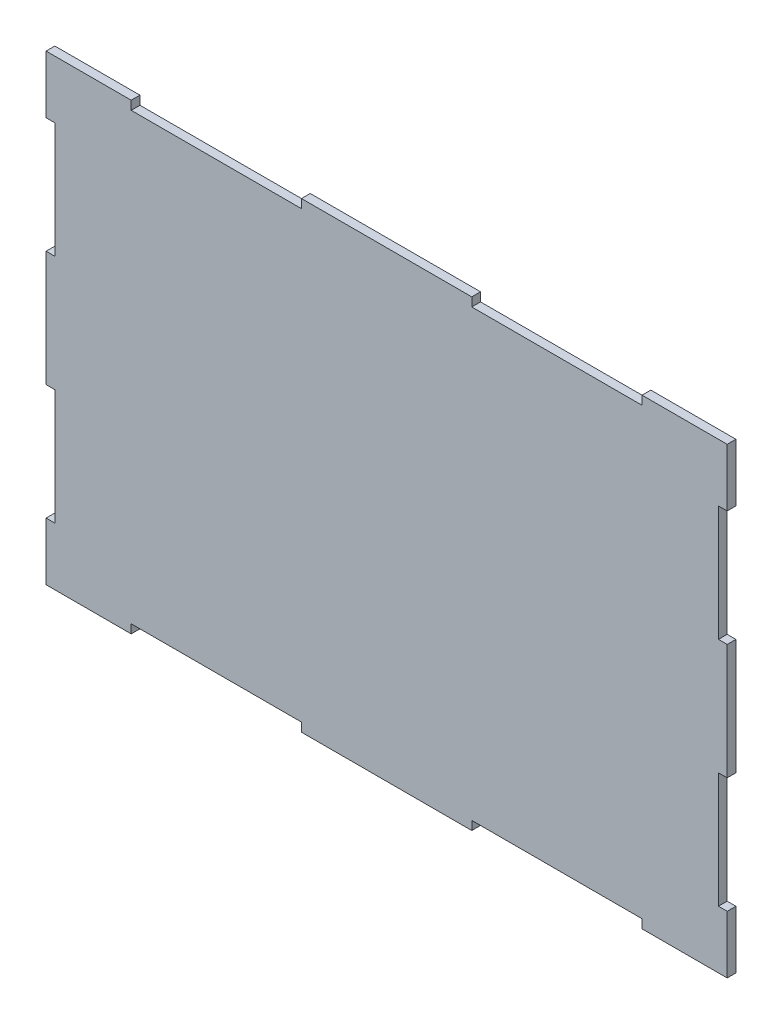
ISO-10303-21;
HEADER;
FILE_DESCRIPTION(('STEP AP214'),'2;1');
FILE_NAME('part.step','',(''),(''),'','','');
FILE_SCHEMA(('AUTOMOTIVE_DESIGN { 1 0 10303 214 1 1 1 1 }'));
ENDSEC;
DATA;
#1=APPLICATION_CONTEXT('core data for automotive mechanical design processes');
#2=APPLICATION_PROTOCOL_DEFINITION('international standard','automotive_design',2000,#1);
#3=PRODUCT_CONTEXT('',#1,'mechanical');
#4=PRODUCT('Part','Part','',(#3));
#5=PRODUCT_RELATED_PRODUCT_CATEGORY('part','',(#4));
#6=PRODUCT_DEFINITION_FORMATION('','',#4);
#7=PRODUCT_DEFINITION_CONTEXT('part definition',#1,'design');
#8=PRODUCT_DEFINITION('design','',#6,#7);
#9=PRODUCT_DEFINITION_SHAPE('','',#8);
#10=(LENGTH_UNIT() NAMED_UNIT(*) SI_UNIT(.MILLI.,.METRE.));
#11=(NAMED_UNIT(*) PLANE_ANGLE_UNIT() SI_UNIT($,.RADIAN.));
#12=(NAMED_UNIT(*) SI_UNIT($,.STERADIAN.) SOLID_ANGLE_UNIT());
#13=UNCERTAINTY_MEASURE_WITH_UNIT(LENGTH_MEASURE(1.E-05),#10,'distance_accuracy_value','');
#14=(GEOMETRIC_REPRESENTATION_CONTEXT(3) GLOBAL_UNCERTAINTY_ASSIGNED_CONTEXT((#13)) GLOBAL_UNIT_ASSIGNED_CONTEXT((#10,
#11,#12)) REPRESENTATION_CONTEXT('',''));
#15=CARTESIAN_POINT('',(0.,0.,0.));
#16=DIRECTION('',(0.,0.,1.));
#17=DIRECTION('',(1.,0.,0.));
#18=AXIS2_PLACEMENT_3D('',#15,#16,#17);
#19=CARTESIAN_POINT('',(140.,-95.,3.6));
#20=DIRECTION('',(-1.,0.,0.));
#21=DIRECTION('',(0.,-1.,0.));
#22=AXIS2_PLACEMENT_3D('',#19,#20,#21);
#23=PLANE('',#22);
#24=DIRECTION('',(0.,1.,0.));
#25=VECTOR('',#24,1.);
#26=CARTESIAN_POINT('',(140.,-95.,0.));
#27=LINE('',#26,#25);
#28=CARTESIAN_POINT('',(140.,-95.,0.));
#29=VERTEX_POINT('',#28);
#30=CARTESIAN_POINT('',(140.,-71.25,0.));
#31=VERTEX_POINT('',#30);
#32=EDGE_CURVE('E299',#29,#31,#27,.T.);
#33=ORIENTED_EDGE('',*,*,#32,.T.);
#34=DIRECTION('',(0.,0.,-1.));
#35=VECTOR('',#34,1.);
#36=CARTESIAN_POINT('',(140.,-71.25,3.6));
#37=LINE('',#36,#35);
#38=CARTESIAN_POINT('',(140.,-71.25,3.6));
#39=VERTEX_POINT('',#38);
#40=EDGE_CURVE('E11',#39,#31,#37,.T.);
#41=ORIENTED_EDGE('',*,*,#40,.F.);
#42=DIRECTION('',(0.,1.,0.));
#43=VECTOR('',#42,1.);
#44=CARTESIAN_POINT('',(140.,-95.,3.6));
#45=LINE('',#44,#43);
#46=CARTESIAN_POINT('',(140.,-95.,3.6));
#47=VERTEX_POINT('',#46);
#48=EDGE_CURVE('E369',#47,#39,#45,.T.);
#49=ORIENTED_EDGE('',*,*,#48,.F.);
#50=DIRECTION('',(0.,0.,-1.));
#51=VECTOR('',#50,1.);
#52=CARTESIAN_POINT('',(140.,-95.,3.6));
#53=LINE('',#52,#51);
#54=EDGE_CURVE('E295',#47,#29,#53,.T.);
#55=ORIENTED_EDGE('',*,*,#54,.T.);
#56=EDGE_LOOP('',(#33,#41,#49,#55));
#57=FACE_BOUND('',#56,.T.);
#58=ADVANCED_FACE('F35',(#57),#23,.F.);
#59=CARTESIAN_POINT('',(140.,-71.25,3.6));
#60=DIRECTION('',(0.,-1.,0.));
#61=DIRECTION('',(0.,0.,-1.));
#62=AXIS2_PLACEMENT_3D('',#59,#60,#61);
#63=PLANE('',#62);
#64=DIRECTION('',(-1.,0.,0.));
#65=VECTOR('',#64,1.);
#66=CARTESIAN_POINT('',(140.,-71.25,0.));
#67=LINE('',#66,#65);
#68=CARTESIAN_POINT('',(136.4,-71.25,0.));
#69=VERTEX_POINT('',#68);
#70=EDGE_CURVE('E302',#31,#69,#67,.T.);
#71=ORIENTED_EDGE('',*,*,#70,.T.);
#72=DIRECTION('',(0.,0.,-1.));
#73=VECTOR('',#72,1.);
#74=CARTESIAN_POINT('',(136.4,-71.25,3.6));
#75=LINE('',#74,#73);
#76=CARTESIAN_POINT('',(136.4,-71.25,3.6));
#77=VERTEX_POINT('',#76);
#78=EDGE_CURVE('E43',#77,#69,#75,.T.);
#79=ORIENTED_EDGE('',*,*,#78,.F.);
#80=DIRECTION('',(-1.,0.,0.));
#81=VECTOR('',#80,1.);
#82=CARTESIAN_POINT('',(140.,-71.25,3.6));
#83=LINE('',#82,#81);
#84=EDGE_CURVE('E178',#39,#77,#83,.T.);
#85=ORIENTED_EDGE('',*,*,#84,.F.);
#86=ORIENTED_EDGE('',*,*,#40,.T.);
#87=EDGE_LOOP('',(#71,#79,#85,#86));
#88=FACE_BOUND('',#87,.T.);
#89=ADVANCED_FACE('F567',(#88),#63,.F.);
#90=CARTESIAN_POINT('',(136.4,-71.25,3.6));
#91=DIRECTION('',(-1.,0.,0.));
#92=DIRECTION('',(0.,-1.,0.));
#93=AXIS2_PLACEMENT_3D('',#90,#91,#92);
#94=PLANE('',#93);
#95=DIRECTION('',(0.,1.,0.));
#96=VECTOR('',#95,1.);
#97=CARTESIAN_POINT('',(136.4,-71.25,0.));
#98=LINE('',#97,#96);
#99=CARTESIAN_POINT('',(136.4,-23.7499999999999,0.));
#100=VERTEX_POINT('',#99);
#101=EDGE_CURVE('E304',#69,#100,#98,.T.);
#102=ORIENTED_EDGE('',*,*,#101,.T.);
#103=DIRECTION('',(0.,0.,-1.));
#104=VECTOR('',#103,1.);
#105=CARTESIAN_POINT('',(136.4,-23.7499999999999,3.6));
#106=LINE('',#105,#104);
#107=CARTESIAN_POINT('',(136.4,-23.7499999999999,3.6));
#108=VERTEX_POINT('',#107);
#109=EDGE_CURVE('E460',#108,#100,#106,.T.);
#110=ORIENTED_EDGE('',*,*,#109,.F.);
#111=DIRECTION('',(0.,1.,0.));
#112=VECTOR('',#111,1.);
#113=CARTESIAN_POINT('',(136.4,-71.25,3.6));
#114=LINE('',#113,#112);
#115=EDGE_CURVE('E468',#77,#108,#114,.T.);
#116=ORIENTED_EDGE('',*,*,#115,.F.);
#117=ORIENTED_EDGE('',*,*,#78,.T.);
#118=EDGE_LOOP('',(#102,#110,#116,#117));
#119=FACE_BOUND('',#118,.T.);
#120=ADVANCED_FACE('F466',(#119),#94,.F.);
#121=CARTESIAN_POINT('',(140.,-23.7499999999999,3.6));
#122=DIRECTION('',(0.,1.,0.));
#123=DIRECTION('',(0.,0.,1.));
#124=AXIS2_PLACEMENT_3D('',#121,#122,#123);
#125=PLANE('',#124);
#126=DIRECTION('',(1.,0.,0.));
#127=VECTOR('',#126,1.);
#128=CARTESIAN_POINT('',(140.,-23.7499999999999,0.));
#129=LINE('',#128,#127);
#130=CARTESIAN_POINT('',(140.,-23.7499999999999,0.));
#131=VERTEX_POINT('',#130);
#132=EDGE_CURVE('E306',#100,#131,#129,.T.);
#133=ORIENTED_EDGE('',*,*,#132,.T.);
#134=DIRECTION('',(0.,0.,-1.));
#135=VECTOR('',#134,1.);
#136=CARTESIAN_POINT('',(140.,-23.7499999999999,3.6));
#137=LINE('',#136,#135);
#138=CARTESIAN_POINT('',(140.,-23.7499999999999,3.6));
#139=VERTEX_POINT('',#138);
#140=EDGE_CURVE('E457',#139,#131,#137,.T.);
#141=ORIENTED_EDGE('',*,*,#140,.F.);
#142=DIRECTION('',(1.,0.,0.));
#143=VECTOR('',#142,1.);
#144=CARTESIAN_POINT('',(140.,-23.7499999999999,3.6));
#145=LINE('',#144,#143);
#146=EDGE_CURVE('E486',#108,#139,#145,.T.);
#147=ORIENTED_EDGE('',*,*,#146,.F.);
#148=ORIENTED_EDGE('',*,*,#109,.T.);
#149=EDGE_LOOP('',(#133,#141,#147,#148));
#150=FACE_BOUND('',#149,.T.);
#151=ADVANCED_FACE('F477',(#150),#125,.F.);
#152=CARTESIAN_POINT('',(140.,23.7500000000001,3.6));
#153=DIRECTION('',(-1.,0.,0.));
#154=DIRECTION('',(0.,0.,1.));
#155=AXIS2_PLACEMENT_3D('',#152,#153,#154);
#156=PLANE('',#155);
#157=DIRECTION('',(0.,1.,0.));
#158=VECTOR('',#157,1.);
#159=CARTESIAN_POINT('',(140.,23.7500000000001,0.));
#160=LINE('',#159,#158);
#161=CARTESIAN_POINT('',(140.,23.7500000000001,0.));
#162=VERTEX_POINT('',#161);
#163=EDGE_CURVE('E308',#131,#162,#160,.T.);
#164=ORIENTED_EDGE('',*,*,#163,.T.);
#165=DIRECTION('',(0.,0.,-1.));
#166=VECTOR('',#165,1.);
#167=CARTESIAN_POINT('',(140.,23.7500000000001,3.6));
#168=LINE('',#167,#166);
#169=CARTESIAN_POINT('',(140.,23.7500000000001,3.6));
#170=VERTEX_POINT('',#169);
#171=EDGE_CURVE('E454',#170,#162,#168,.T.);
#172=ORIENTED_EDGE('',*,*,#171,.F.);
#173=DIRECTION('',(0.,1.,0.));
#174=VECTOR('',#173,1.);
#175=CARTESIAN_POINT('',(140.,23.7500000000001,3.6));
#176=LINE('',#175,#174);
#177=EDGE_CURVE('E483',#139,#170,#176,.T.);
#178=ORIENTED_EDGE('',*,*,#177,.F.);
#179=ORIENTED_EDGE('',*,*,#140,.T.);
#180=EDGE_LOOP('',(#164,#172,#178,#179));
#181=FACE_BOUND('',#180,.T.);
#182=ADVANCED_FACE('F481',(#181),#156,.F.);
#183=CARTESIAN_POINT('',(140.,23.7500000000001,3.6));
#184=DIRECTION('',(0.,-1.,0.));
#185=DIRECTION('',(0.,0.,-1.));
#186=AXIS2_PLACEMENT_3D('',#183,#184,#185);
#187=PLANE('',#186);
#188=DIRECTION('',(-1.,0.,0.));
#189=VECTOR('',#188,1.);
#190=CARTESIAN_POINT('',(140.,23.7500000000001,0.));
#191=LINE('',#190,#189);
#192=CARTESIAN_POINT('',(136.4,23.7500000000001,0.));
#193=VERTEX_POINT('',#192);
#194=EDGE_CURVE('E310',#162,#193,#191,.T.);
#195=ORIENTED_EDGE('',*,*,#194,.T.);
#196=DIRECTION('',(0.,0.,-1.));
#197=VECTOR('',#196,1.);
#198=CARTESIAN_POINT('',(136.4,23.7500000000001,3.6));
#199=LINE('',#198,#197);
#200=CARTESIAN_POINT('',(136.4,23.7500000000001,3.6));
#201=VERTEX_POINT('',#200);
#202=EDGE_CURVE('E451',#201,#193,#199,.T.);
#203=ORIENTED_EDGE('',*,*,#202,.F.);
#204=DIRECTION('',(-1.,0.,0.));
#205=VECTOR('',#204,1.);
#206=CARTESIAN_POINT('',(140.,23.7500000000001,3.6));
#207=LINE('',#206,#205);
#208=EDGE_CURVE('E485',#170,#201,#207,.T.);
#209=ORIENTED_EDGE('',*,*,#208,.F.);
#210=ORIENTED_EDGE('',*,*,#171,.T.);
#211=EDGE_LOOP('',(#195,#203,#209,#210));
#212=FACE_BOUND('',#211,.T.);
#213=ADVANCED_FACE('F580',(#212),#187,.F.);
#214=CARTESIAN_POINT('',(136.4,71.2500000000001,3.6));
#215=DIRECTION('',(-1.,0.,0.));
#216=DIRECTION('',(0.,-1.,0.));
#217=AXIS2_PLACEMENT_3D('',#214,#215,#216);
#218=PLANE('',#217);
#219=DIRECTION('',(0.,1.,0.));
#220=VECTOR('',#219,1.);
#221=CARTESIAN_POINT('',(136.4,71.2500000000001,0.));
#222=LINE('',#221,#220);
#223=CARTESIAN_POINT('',(136.4,71.2500000000001,0.));
#224=VERTEX_POINT('',#223);
#225=EDGE_CURVE('E312',#193,#224,#222,.T.);
#226=ORIENTED_EDGE('',*,*,#225,.T.);
#227=DIRECTION('',(0.,0.,-1.));
#228=VECTOR('',#227,1.);
#229=CARTESIAN_POINT('',(136.4,71.2500000000001,3.6));
#230=LINE('',#229,#228);
#231=CARTESIAN_POINT('',(136.4,71.2500000000001,3.6));
#232=VERTEX_POINT('',#231);
#233=EDGE_CURVE('E448',#232,#224,#230,.T.);
#234=ORIENTED_EDGE('',*,*,#233,.F.);
#235=DIRECTION('',(0.,1.,0.));
#236=VECTOR('',#235,1.);
#237=CARTESIAN_POINT('',(136.4,71.2500000000001,3.6));
#238=LINE('',#237,#236);
#239=EDGE_CURVE('E488',#201,#232,#238,.T.);
#240=ORIENTED_EDGE('',*,*,#239,.F.);
#241=ORIENTED_EDGE('',*,*,#202,.T.);
#242=EDGE_LOOP('',(#226,#234,#240,#241));
#243=FACE_BOUND('',#242,.T.);
#244=ADVANCED_FACE('F583',(#243),#218,.F.);
#245=CARTESIAN_POINT('',(140.,71.2500000000001,3.6));
#246=DIRECTION('',(0.,1.,0.));
#247=DIRECTION('',(0.,0.,1.));
#248=AXIS2_PLACEMENT_3D('',#245,#246,#247);
#249=PLANE('',#248);
#250=DIRECTION('',(1.,0.,0.));
#251=VECTOR('',#250,1.);
#252=CARTESIAN_POINT('',(140.,71.2500000000001,0.));
#253=LINE('',#252,#251);
#254=CARTESIAN_POINT('',(140.,71.2500000000001,0.));
#255=VERTEX_POINT('',#254);
#256=EDGE_CURVE('E314',#224,#255,#253,.T.);
#257=ORIENTED_EDGE('',*,*,#256,.T.);
#258=DIRECTION('',(0.,0.,-1.));
#259=VECTOR('',#258,1.);
#260=CARTESIAN_POINT('',(140.,71.2500000000001,3.6));
#261=LINE('',#260,#259);
#262=CARTESIAN_POINT('',(140.,71.2500000000001,3.6));
#263=VERTEX_POINT('',#262);
#264=EDGE_CURVE('E445',#263,#255,#261,.T.);
#265=ORIENTED_EDGE('',*,*,#264,.F.);
#266=DIRECTION('',(1.,0.,0.));
#267=VECTOR('',#266,1.);
#268=CARTESIAN_POINT('',(140.,71.2500000000001,3.6));
#269=LINE('',#268,#267);
#270=EDGE_CURVE('E494',#232,#263,#269,.T.);
#271=ORIENTED_EDGE('',*,*,#270,.F.);
#272=ORIENTED_EDGE('',*,*,#233,.T.);
#273=EDGE_LOOP('',(#257,#265,#271,#272));
#274=FACE_BOUND('',#273,.T.);
#275=ADVANCED_FACE('F587',(#274),#249,.F.);
#276=CARTESIAN_POINT('',(140.,95.,3.6));
#277=DIRECTION('',(-1.,0.,0.));
#278=DIRECTION('',(0.,-1.,0.));
#279=AXIS2_PLACEMENT_3D('',#276,#277,#278);
#280=PLANE('',#279);
#281=DIRECTION('',(0.,1.,0.));
#282=VECTOR('',#281,1.);
#283=CARTESIAN_POINT('',(140.,95.,0.));
#284=LINE('',#283,#282);
#285=CARTESIAN_POINT('',(140.,95.,0.));
#286=VERTEX_POINT('',#285);
#287=EDGE_CURVE('E316',#255,#286,#284,.T.);
#288=ORIENTED_EDGE('',*,*,#287,.T.);
#289=DIRECTION('',(0.,0.,-1.));
#290=VECTOR('',#289,1.);
#291=CARTESIAN_POINT('',(140.,95.,3.6));
#292=LINE('',#291,#290);
#293=CARTESIAN_POINT('',(140.,95.,3.6));
#294=VERTEX_POINT('',#293);
#295=EDGE_CURVE('E442',#294,#286,#292,.T.);
#296=ORIENTED_EDGE('',*,*,#295,.F.);
#297=DIRECTION('',(0.,1.,0.));
#298=VECTOR('',#297,1.);
#299=CARTESIAN_POINT('',(140.,95.,3.6));
#300=LINE('',#299,#298);
#301=EDGE_CURVE('E496',#263,#294,#300,.T.);
#302=ORIENTED_EDGE('',*,*,#301,.F.);
#303=ORIENTED_EDGE('',*,*,#264,.T.);
#304=EDGE_LOOP('',(#288,#296,#302,#303));
#305=FACE_BOUND('',#304,.T.);
#306=ADVANCED_FACE('F591',(#305),#280,.F.);
#307=CARTESIAN_POINT('',(140.,95.,3.6));
#308=DIRECTION('',(0.,-1.,0.));
#309=DIRECTION('',(1.,0.,0.));
#310=AXIS2_PLACEMENT_3D('',#307,#308,#309);
#311=PLANE('',#310);
#312=DIRECTION('',(-1.,0.,0.));
#313=VECTOR('',#312,1.);
#314=CARTESIAN_POINT('',(140.,95.,0.));
#315=LINE('',#314,#313);
#316=CARTESIAN_POINT('',(105.,95.,0.));
#317=VERTEX_POINT('',#316);
#318=EDGE_CURVE('E318',#286,#317,#315,.T.);
#319=ORIENTED_EDGE('',*,*,#318,.T.);
#320=DIRECTION('',(0.,0.,-1.));
#321=VECTOR('',#320,1.);
#322=CARTESIAN_POINT('',(105.,95.,3.6));
#323=LINE('',#322,#321);
#324=CARTESIAN_POINT('',(105.,95.,3.6));
#325=VERTEX_POINT('',#324);
#326=EDGE_CURVE('E439',#325,#317,#323,.T.);
#327=ORIENTED_EDGE('',*,*,#326,.F.);
#328=DIRECTION('',(-1.,0.,0.));
#329=VECTOR('',#328,1.);
#330=CARTESIAN_POINT('',(140.,95.,3.6));
#331=LINE('',#330,#329);
#332=EDGE_CURVE('E498',#294,#325,#331,.T.);
#333=ORIENTED_EDGE('',*,*,#332,.F.);
#334=ORIENTED_EDGE('',*,*,#295,.T.);
#335=EDGE_LOOP('',(#319,#327,#333,#334));
#336=FACE_BOUND('',#335,.T.);
#337=ADVANCED_FACE('F595',(#336),#311,.F.);
#338=CARTESIAN_POINT('',(105.,95.,3.6));
#339=DIRECTION('',(1.,0.,0.));
#340=DIRECTION('',(0.,0.,-1.));
#341=AXIS2_PLACEMENT_3D('',#338,#339,#340);
#342=PLANE('',#341);
#343=DIRECTION('',(0.,-1.,0.));
#344=VECTOR('',#343,1.);
#345=CARTESIAN_POINT('',(105.,95.,0.));
#346=LINE('',#345,#344);
#347=CARTESIAN_POINT('',(105.,91.4,0.));
#348=VERTEX_POINT('',#347);
#349=EDGE_CURVE('E320',#317,#348,#346,.T.);
#350=ORIENTED_EDGE('',*,*,#349,.T.);
#351=DIRECTION('',(0.,0.,-1.));
#352=VECTOR('',#351,1.);
#353=CARTESIAN_POINT('',(105.,91.4,3.6));
#354=LINE('',#353,#352);
#355=CARTESIAN_POINT('',(105.,91.4,3.6));
#356=VERTEX_POINT('',#355);
#357=EDGE_CURVE('E436',#356,#348,#354,.T.);
#358=ORIENTED_EDGE('',*,*,#357,.F.);
#359=DIRECTION('',(0.,-1.,0.));
#360=VECTOR('',#359,1.);
#361=CARTESIAN_POINT('',(105.,95.,3.6));
#362=LINE('',#361,#360);
#363=EDGE_CURVE('E500',#325,#356,#362,.T.);
#364=ORIENTED_EDGE('',*,*,#363,.F.);
#365=ORIENTED_EDGE('',*,*,#326,.T.);
#366=EDGE_LOOP('',(#350,#358,#364,#365));
#367=FACE_BOUND('',#366,.T.);
#368=ADVANCED_FACE('F599',(#367),#342,.F.);
#369=CARTESIAN_POINT('',(105.,91.4,3.6));
#370=DIRECTION('',(0.,-1.,0.));
#371=DIRECTION('',(1.,0.,0.));
#372=AXIS2_PLACEMENT_3D('',#369,#370,#371);
#373=PLANE('',#372);
#374=DIRECTION('',(-1.,0.,0.));
#375=VECTOR('',#374,1.);
#376=CARTESIAN_POINT('',(105.,91.4,0.));
#377=LINE('',#376,#375);
#378=CARTESIAN_POINT('',(35.,91.4,0.));
#379=VERTEX_POINT('',#378);
#380=EDGE_CURVE('E322',#348,#379,#377,.T.);
#381=ORIENTED_EDGE('',*,*,#380,.T.);
#382=DIRECTION('',(0.,0.,-1.));
#383=VECTOR('',#382,1.);
#384=CARTESIAN_POINT('',(35.,91.4,3.6));
#385=LINE('',#384,#383);
#386=CARTESIAN_POINT('',(35.,91.4,3.6));
#387=VERTEX_POINT('',#386);
#388=EDGE_CURVE('E433',#387,#379,#385,.T.);
#389=ORIENTED_EDGE('',*,*,#388,.F.);
#390=DIRECTION('',(-1.,0.,0.));
#391=VECTOR('',#390,1.);
#392=CARTESIAN_POINT('',(105.,91.4,3.6));
#393=LINE('',#392,#391);
#394=EDGE_CURVE('E502',#356,#387,#393,.T.);
#395=ORIENTED_EDGE('',*,*,#394,.F.);
#396=ORIENTED_EDGE('',*,*,#357,.T.);
#397=EDGE_LOOP('',(#381,#389,#395,#396));
#398=FACE_BOUND('',#397,.T.);
#399=ADVANCED_FACE('F603',(#398),#373,.F.);
#400=CARTESIAN_POINT('',(35.,95.,3.6));
#401=DIRECTION('',(-1.,0.,0.));
#402=DIRECTION('',(0.,0.,1.));
#403=AXIS2_PLACEMENT_3D('',#400,#401,#402);
#404=PLANE('',#403);
#405=DIRECTION('',(0.,1.,0.));
#406=VECTOR('',#405,1.);
#407=CARTESIAN_POINT('',(35.,95.,0.));
#408=LINE('',#407,#406);
#409=CARTESIAN_POINT('',(35.,95.,0.));
#410=VERTEX_POINT('',#409);
#411=EDGE_CURVE('E324',#379,#410,#408,.T.);
#412=ORIENTED_EDGE('',*,*,#411,.T.);
#413=DIRECTION('',(0.,0.,-1.));
#414=VECTOR('',#413,1.);
#415=CARTESIAN_POINT('',(35.,95.,3.6));
#416=LINE('',#415,#414);
#417=CARTESIAN_POINT('',(35.,95.,3.6));
#418=VERTEX_POINT('',#417);
#419=EDGE_CURVE('E430',#418,#410,#416,.T.);
#420=ORIENTED_EDGE('',*,*,#419,.F.);
#421=DIRECTION('',(0.,1.,0.));
#422=VECTOR('',#421,1.);
#423=CARTESIAN_POINT('',(35.,95.,3.6));
#424=LINE('',#423,#422);
#425=EDGE_CURVE('E504',#387,#418,#424,.T.);
#426=ORIENTED_EDGE('',*,*,#425,.F.);
#427=ORIENTED_EDGE('',*,*,#388,.T.);
#428=EDGE_LOOP('',(#412,#420,#426,#427));
#429=FACE_BOUND('',#428,.T.);
#430=ADVANCED_FACE('F607',(#429),#404,.F.);
#431=CARTESIAN_POINT('',(-35.,95.,3.6));
#432=DIRECTION('',(0.,-1.,0.));
#433=DIRECTION('',(1.,0.,0.));
#434=AXIS2_PLACEMENT_3D('',#431,#432,#433);
#435=PLANE('',#434);
#436=DIRECTION('',(-1.,0.,0.));
#437=VECTOR('',#436,1.);
#438=CARTESIAN_POINT('',(-35.,95.,0.));
#439=LINE('',#438,#437);
#440=CARTESIAN_POINT('',(-35.,95.,0.));
#441=VERTEX_POINT('',#440);
#442=EDGE_CURVE('E326',#410,#441,#439,.T.);
#443=ORIENTED_EDGE('',*,*,#442,.T.);
#444=DIRECTION('',(0.,0.,-1.));
#445=VECTOR('',#444,1.);
#446=CARTESIAN_POINT('',(-35.,95.,3.6));
#447=LINE('',#446,#445);
#448=CARTESIAN_POINT('',(-35.,95.,3.6));
#449=VERTEX_POINT('',#448);
#450=EDGE_CURVE('E427',#449,#441,#447,.T.);
#451=ORIENTED_EDGE('',*,*,#450,.F.);
#452=DIRECTION('',(-1.,0.,0.));
#453=VECTOR('',#452,1.);
#454=CARTESIAN_POINT('',(-35.,95.,3.6));
#455=LINE('',#454,#453);
#456=EDGE_CURVE('E506',#418,#449,#455,.T.);
#457=ORIENTED_EDGE('',*,*,#456,.F.);
#458=ORIENTED_EDGE('',*,*,#419,.T.);
#459=EDGE_LOOP('',(#443,#451,#457,#458));
#460=FACE_BOUND('',#459,.T.);
#461=ADVANCED_FACE('F611',(#460),#435,.F.);
#462=CARTESIAN_POINT('',(-35.,95.,3.6));
#463=DIRECTION('',(1.,0.,0.));
#464=DIRECTION('',(0.,0.,-1.));
#465=AXIS2_PLACEMENT_3D('',#462,#463,#464);
#466=PLANE('',#465);
#467=DIRECTION('',(0.,-1.,0.));
#468=VECTOR('',#467,1.);
#469=CARTESIAN_POINT('',(-35.,95.,0.));
#470=LINE('',#469,#468);
#471=CARTESIAN_POINT('',(-35.,91.4,0.));
#472=VERTEX_POINT('',#471);
#473=EDGE_CURVE('E328',#441,#472,#470,.T.);
#474=ORIENTED_EDGE('',*,*,#473,.T.);
#475=DIRECTION('',(0.,0.,-1.));
#476=VECTOR('',#475,1.);
#477=CARTESIAN_POINT('',(-35.,91.4,3.6));
#478=LINE('',#477,#476);
#479=CARTESIAN_POINT('',(-35.,91.4,3.6));
#480=VERTEX_POINT('',#479);
#481=EDGE_CURVE('E424',#480,#472,#478,.T.);
#482=ORIENTED_EDGE('',*,*,#481,.F.);
#483=DIRECTION('',(0.,-1.,0.));
#484=VECTOR('',#483,1.);
#485=CARTESIAN_POINT('',(-35.,95.,3.6));
#486=LINE('',#485,#484);
#487=EDGE_CURVE('E508',#449,#480,#486,.T.);
#488=ORIENTED_EDGE('',*,*,#487,.F.);
#489=ORIENTED_EDGE('',*,*,#450,.T.);
#490=EDGE_LOOP('',(#474,#482,#488,#489));
#491=FACE_BOUND('',#490,.T.);
#492=ADVANCED_FACE('F615',(#491),#466,.F.);
#493=CARTESIAN_POINT('',(-105.,91.4,3.6));
#494=DIRECTION('',(0.,-1.,0.));
#495=DIRECTION('',(0.,0.,-1.));
#496=AXIS2_PLACEMENT_3D('',#493,#494,#495);
#497=PLANE('',#496);
#498=DIRECTION('',(-1.,0.,0.));
#499=VECTOR('',#498,1.);
#500=CARTESIAN_POINT('',(-105.,91.4,0.));
#501=LINE('',#500,#499);
#502=CARTESIAN_POINT('',(-105.,91.4,0.));
#503=VERTEX_POINT('',#502);
#504=EDGE_CURVE('E330',#472,#503,#501,.T.);
#505=ORIENTED_EDGE('',*,*,#504,.T.);
#506=DIRECTION('',(0.,0.,-1.));
#507=VECTOR('',#506,1.);
#508=CARTESIAN_POINT('',(-105.,91.4,3.6));
#509=LINE('',#508,#507);
#510=CARTESIAN_POINT('',(-105.,91.4,3.6));
#511=VERTEX_POINT('',#510);
#512=EDGE_CURVE('E421',#511,#503,#509,.T.);
#513=ORIENTED_EDGE('',*,*,#512,.F.);
#514=DIRECTION('',(-1.,0.,0.));
#515=VECTOR('',#514,1.);
#516=CARTESIAN_POINT('',(-105.,91.4,3.6));
#517=LINE('',#516,#515);
#518=EDGE_CURVE('E510',#480,#511,#517,.T.);
#519=ORIENTED_EDGE('',*,*,#518,.F.);
#520=ORIENTED_EDGE('',*,*,#481,.T.);
#521=EDGE_LOOP('',(#505,#513,#519,#520));
#522=FACE_BOUND('',#521,.T.);
#523=ADVANCED_FACE('F619',(#522),#497,.F.);
#524=CARTESIAN_POINT('',(-105.,95.,3.6));
#525=DIRECTION('',(-1.,0.,0.));
#526=DIRECTION('',(0.,0.,1.));
#527=AXIS2_PLACEMENT_3D('',#524,#525,#526);
#528=PLANE('',#527);
#529=DIRECTION('',(0.,1.,0.));
#530=VECTOR('',#529,1.);
#531=CARTESIAN_POINT('',(-105.,95.,0.));
#532=LINE('',#531,#530);
#533=CARTESIAN_POINT('',(-105.,95.,0.));
#534=VERTEX_POINT('',#533);
#535=EDGE_CURVE('E332',#503,#534,#532,.T.);
#536=ORIENTED_EDGE('',*,*,#535,.T.);
#537=DIRECTION('',(0.,0.,-1.));
#538=VECTOR('',#537,1.);
#539=CARTESIAN_POINT('',(-105.,95.,3.6));
#540=LINE('',#539,#538);
#541=CARTESIAN_POINT('',(-105.,95.,3.6));
#542=VERTEX_POINT('',#541);
#543=EDGE_CURVE('E418',#542,#534,#540,.T.);
#544=ORIENTED_EDGE('',*,*,#543,.F.);
#545=DIRECTION('',(0.,1.,0.));
#546=VECTOR('',#545,1.);
#547=CARTESIAN_POINT('',(-105.,95.,3.6));
#548=LINE('',#547,#546);
#549=EDGE_CURVE('E512',#511,#542,#548,.T.);
#550=ORIENTED_EDGE('',*,*,#549,.F.);
#551=ORIENTED_EDGE('',*,*,#512,.T.);
#552=EDGE_LOOP('',(#536,#544,#550,#551));
#553=FACE_BOUND('',#552,.T.);
#554=ADVANCED_FACE('F623',(#553),#528,.F.);
#555=CARTESIAN_POINT('',(-140.,95.,3.6));
#556=DIRECTION('',(0.,-1.,0.));
#557=DIRECTION('',(0.,0.,-1.));
#558=AXIS2_PLACEMENT_3D('',#555,#556,#557);
#559=PLANE('',#558);
#560=DIRECTION('',(-1.,0.,0.));
#561=VECTOR('',#560,1.);
#562=CARTESIAN_POINT('',(-140.,95.,0.));
#563=LINE('',#562,#561);
#564=CARTESIAN_POINT('',(-140.,95.,0.));
#565=VERTEX_POINT('',#564);
#566=EDGE_CURVE('E334',#534,#565,#563,.T.);
#567=ORIENTED_EDGE('',*,*,#566,.T.);
#568=DIRECTION('',(0.,0.,-1.));
#569=VECTOR('',#568,1.);
#570=CARTESIAN_POINT('',(-140.,95.,3.6));
#571=LINE('',#570,#569);
#572=CARTESIAN_POINT('',(-140.,95.,3.6));
#573=VERTEX_POINT('',#572);
#574=EDGE_CURVE('E415',#573,#565,#571,.T.);
#575=ORIENTED_EDGE('',*,*,#574,.F.);
#576=DIRECTION('',(-1.,0.,0.));
#577=VECTOR('',#576,1.);
#578=CARTESIAN_POINT('',(-140.,95.,3.6));
#579=LINE('',#578,#577);
#580=EDGE_CURVE('E514',#542,#573,#579,.T.);
#581=ORIENTED_EDGE('',*,*,#580,.F.);
#582=ORIENTED_EDGE('',*,*,#543,.T.);
#583=EDGE_LOOP('',(#567,#575,#581,#582));
#584=FACE_BOUND('',#583,.T.);
#585=ADVANCED_FACE('F627',(#584),#559,.F.);
#586=CARTESIAN_POINT('',(-140.,95.,3.6));
#587=DIRECTION('',(1.,0.,0.));
#588=DIRECTION('',(0.,1.,0.));
#589=AXIS2_PLACEMENT_3D('',#586,#587,#588);
#590=PLANE('',#589);
#591=DIRECTION('',(0.,-1.,0.));
#592=VECTOR('',#591,1.);
#593=CARTESIAN_POINT('',(-140.,95.,0.));
#594=LINE('',#593,#592);
#595=CARTESIAN_POINT('',(-140.,71.25,0.));
#596=VERTEX_POINT('',#595);
#597=EDGE_CURVE('E336',#565,#596,#594,.T.);
#598=ORIENTED_EDGE('',*,*,#597,.T.);
#599=DIRECTION('',(0.,0.,-1.));
#600=VECTOR('',#599,1.);
#601=CARTESIAN_POINT('',(-140.,71.25,3.6));
#602=LINE('',#601,#600);
#603=CARTESIAN_POINT('',(-140.,71.25,3.6));
#604=VERTEX_POINT('',#603);
#605=EDGE_CURVE('E412',#604,#596,#602,.T.);
#606=ORIENTED_EDGE('',*,*,#605,.F.);
#607=DIRECTION('',(0.,-1.,0.));
#608=VECTOR('',#607,1.);
#609=CARTESIAN_POINT('',(-140.,95.,3.6));
#610=LINE('',#609,#608);
#611=EDGE_CURVE('E516',#573,#604,#610,.T.);
#612=ORIENTED_EDGE('',*,*,#611,.F.);
#613=ORIENTED_EDGE('',*,*,#574,.T.);
#614=EDGE_LOOP('',(#598,#606,#612,#613));
#615=FACE_BOUND('',#614,.T.);
#616=ADVANCED_FACE('F631',(#615),#590,.F.);
#617=CARTESIAN_POINT('',(-140.,71.25,3.6));
#618=DIRECTION('',(0.,1.,0.));
#619=DIRECTION('',(0.,0.,1.));
#620=AXIS2_PLACEMENT_3D('',#617,#618,#619);
#621=PLANE('',#620);
#622=DIRECTION('',(1.,0.,0.));
#623=VECTOR('',#622,1.);
#624=CARTESIAN_POINT('',(-140.,71.25,0.));
#625=LINE('',#624,#623);
#626=CARTESIAN_POINT('',(-136.4,71.25,0.));
#627=VERTEX_POINT('',#626);
#628=EDGE_CURVE('E338',#596,#627,#625,.T.);
#629=ORIENTED_EDGE('',*,*,#628,.T.);
#630=DIRECTION('',(0.,0.,-1.));
#631=VECTOR('',#630,1.);
#632=CARTESIAN_POINT('',(-136.4,71.25,3.6));
#633=LINE('',#632,#631);
#634=CARTESIAN_POINT('',(-136.4,71.25,3.6));
#635=VERTEX_POINT('',#634);
#636=EDGE_CURVE('E409',#635,#627,#633,.T.);
#637=ORIENTED_EDGE('',*,*,#636,.F.);
#638=DIRECTION('',(1.,0.,0.));
#639=VECTOR('',#638,1.);
#640=CARTESIAN_POINT('',(-140.,71.25,3.6));
#641=LINE('',#640,#639);
#642=EDGE_CURVE('E518',#604,#635,#641,.T.);
#643=ORIENTED_EDGE('',*,*,#642,.F.);
#644=ORIENTED_EDGE('',*,*,#605,.T.);
#645=EDGE_LOOP('',(#629,#637,#643,#644));
#646=FACE_BOUND('',#645,.T.);
#647=ADVANCED_FACE('F635',(#646),#621,.F.);
#648=CARTESIAN_POINT('',(-136.4,71.25,3.6));
#649=DIRECTION('',(1.,0.,0.));
#650=DIRECTION('',(0.,0.,-1.));
#651=AXIS2_PLACEMENT_3D('',#648,#649,#650);
#652=PLANE('',#651);
#653=DIRECTION('',(0.,-1.,0.));
#654=VECTOR('',#653,1.);
#655=CARTESIAN_POINT('',(-136.4,71.25,0.));
#656=LINE('',#655,#654);
#657=CARTESIAN_POINT('',(-136.4,23.75,0.));
#658=VERTEX_POINT('',#657);
#659=EDGE_CURVE('E340',#627,#658,#656,.T.);
#660=ORIENTED_EDGE('',*,*,#659,.T.);
#661=DIRECTION('',(0.,0.,-1.));
#662=VECTOR('',#661,1.);
#663=CARTESIAN_POINT('',(-136.4,23.75,3.6));
#664=LINE('',#663,#662);
#665=CARTESIAN_POINT('',(-136.4,23.75,3.6));
#666=VERTEX_POINT('',#665);
#667=EDGE_CURVE('E406',#666,#658,#664,.T.);
#668=ORIENTED_EDGE('',*,*,#667,.F.);
#669=DIRECTION('',(0.,-1.,0.));
#670=VECTOR('',#669,1.);
#671=CARTESIAN_POINT('',(-136.4,71.25,3.6));
#672=LINE('',#671,#670);
#673=EDGE_CURVE('E520',#635,#666,#672,.T.);
#674=ORIENTED_EDGE('',*,*,#673,.F.);
#675=ORIENTED_EDGE('',*,*,#636,.T.);
#676=EDGE_LOOP('',(#660,#668,#674,#675));
#677=FACE_BOUND('',#676,.T.);
#678=ADVANCED_FACE('F639',(#677),#652,.F.);
#679=CARTESIAN_POINT('',(-140.,23.75,3.6));
#680=DIRECTION('',(0.,-1.,0.));
#681=DIRECTION('',(0.,0.,-1.));
#682=AXIS2_PLACEMENT_3D('',#679,#680,#681);
#683=PLANE('',#682);
#684=DIRECTION('',(-1.,0.,0.));
#685=VECTOR('',#684,1.);
#686=CARTESIAN_POINT('',(-140.,23.75,0.));
#687=LINE('',#686,#685);
#688=CARTESIAN_POINT('',(-140.,23.75,0.));
#689=VERTEX_POINT('',#688);
#690=EDGE_CURVE('E342',#658,#689,#687,.T.);
#691=ORIENTED_EDGE('',*,*,#690,.T.);
#692=DIRECTION('',(0.,0.,-1.));
#693=VECTOR('',#692,1.);
#694=CARTESIAN_POINT('',(-140.,23.75,3.6));
#695=LINE('',#694,#693);
#696=CARTESIAN_POINT('',(-140.,23.75,3.6));
#697=VERTEX_POINT('',#696);
#698=EDGE_CURVE('E403',#697,#689,#695,.T.);
#699=ORIENTED_EDGE('',*,*,#698,.F.);
#700=DIRECTION('',(-1.,0.,0.));
#701=VECTOR('',#700,1.);
#702=CARTESIAN_POINT('',(-140.,23.75,3.6));
#703=LINE('',#702,#701);
#704=EDGE_CURVE('E522',#666,#697,#703,.T.);
#705=ORIENTED_EDGE('',*,*,#704,.F.);
#706=ORIENTED_EDGE('',*,*,#667,.T.);
#707=EDGE_LOOP('',(#691,#699,#705,#706));
#708=FACE_BOUND('',#707,.T.);
#709=ADVANCED_FACE('F643',(#708),#683,.F.);
#710=CARTESIAN_POINT('',(-140.,23.75,3.6));
#711=DIRECTION('',(1.,0.,0.));
#712=DIRECTION('',(0.,0.,-1.));
#713=AXIS2_PLACEMENT_3D('',#710,#711,#712);
#714=PLANE('',#713);
#715=DIRECTION('',(0.,-1.,0.));
#716=VECTOR('',#715,1.);
#717=CARTESIAN_POINT('',(-140.,23.75,0.));
#718=LINE('',#717,#716);
#719=CARTESIAN_POINT('',(-140.,-23.75,0.));
#720=VERTEX_POINT('',#719);
#721=EDGE_CURVE('E344',#689,#720,#718,.T.);
#722=ORIENTED_EDGE('',*,*,#721,.T.);
#723=DIRECTION('',(0.,0.,-1.));
#724=VECTOR('',#723,1.);
#725=CARTESIAN_POINT('',(-140.,-23.75,3.6));
#726=LINE('',#725,#724);
#727=CARTESIAN_POINT('',(-140.,-23.75,3.6));
#728=VERTEX_POINT('',#727);
#729=EDGE_CURVE('E400',#728,#720,#726,.T.);
#730=ORIENTED_EDGE('',*,*,#729,.F.);
#731=DIRECTION('',(0.,-1.,0.));
#732=VECTOR('',#731,1.);
#733=CARTESIAN_POINT('',(-140.,23.75,3.6));
#734=LINE('',#733,#732);
#735=EDGE_CURVE('E524',#697,#728,#734,.T.);
#736=ORIENTED_EDGE('',*,*,#735,.F.);
#737=ORIENTED_EDGE('',*,*,#698,.T.);
#738=EDGE_LOOP('',(#722,#730,#736,#737));
#739=FACE_BOUND('',#738,.T.);
#740=ADVANCED_FACE('F647',(#739),#714,.F.);
#741=CARTESIAN_POINT('',(-140.,-23.75,3.6));
#742=DIRECTION('',(0.,1.,0.));
#743=DIRECTION('',(0.,0.,1.));
#744=AXIS2_PLACEMENT_3D('',#741,#742,#743);
#745=PLANE('',#744);
#746=DIRECTION('',(1.,0.,0.));
#747=VECTOR('',#746,1.);
#748=CARTESIAN_POINT('',(-140.,-23.75,0.));
#749=LINE('',#748,#747);
#750=CARTESIAN_POINT('',(-136.4,-23.75,0.));
#751=VERTEX_POINT('',#750);
#752=EDGE_CURVE('E346',#720,#751,#749,.T.);
#753=ORIENTED_EDGE('',*,*,#752,.T.);
#754=DIRECTION('',(0.,0.,-1.));
#755=VECTOR('',#754,1.);
#756=CARTESIAN_POINT('',(-136.4,-23.75,3.6));
#757=LINE('',#756,#755);
#758=CARTESIAN_POINT('',(-136.4,-23.75,3.6));
#759=VERTEX_POINT('',#758);
#760=EDGE_CURVE('E397',#759,#751,#757,.T.);
#761=ORIENTED_EDGE('',*,*,#760,.F.);
#762=DIRECTION('',(1.,0.,0.));
#763=VECTOR('',#762,1.);
#764=CARTESIAN_POINT('',(-140.,-23.75,3.6));
#765=LINE('',#764,#763);
#766=EDGE_CURVE('E526',#728,#759,#765,.T.);
#767=ORIENTED_EDGE('',*,*,#766,.F.);
#768=ORIENTED_EDGE('',*,*,#729,.T.);
#769=EDGE_LOOP('',(#753,#761,#767,#768));
#770=FACE_BOUND('',#769,.T.);
#771=ADVANCED_FACE('F651',(#770),#745,.F.);
#772=CARTESIAN_POINT('',(-136.4,-71.25,3.6));
#773=DIRECTION('',(1.,0.,0.));
#774=DIRECTION('',(0.,0.,-1.));
#775=AXIS2_PLACEMENT_3D('',#772,#773,#774);
#776=PLANE('',#775);
#777=DIRECTION('',(0.,-1.,0.));
#778=VECTOR('',#777,1.);
#779=CARTESIAN_POINT('',(-136.4,-71.25,0.));
#780=LINE('',#779,#778);
#781=CARTESIAN_POINT('',(-136.4,-71.25,0.));
#782=VERTEX_POINT('',#781);
#783=EDGE_CURVE('E348',#751,#782,#780,.T.);
#784=ORIENTED_EDGE('',*,*,#783,.T.);
#785=DIRECTION('',(0.,0.,-1.));
#786=VECTOR('',#785,1.);
#787=CARTESIAN_POINT('',(-136.4,-71.25,3.6));
#788=LINE('',#787,#786);
#789=CARTESIAN_POINT('',(-136.4,-71.25,3.6));
#790=VERTEX_POINT('',#789);
#791=EDGE_CURVE('E394',#790,#782,#788,.T.);
#792=ORIENTED_EDGE('',*,*,#791,.F.);
#793=DIRECTION('',(0.,-1.,0.));
#794=VECTOR('',#793,1.);
#795=CARTESIAN_POINT('',(-136.4,-71.25,3.6));
#796=LINE('',#795,#794);
#797=EDGE_CURVE('E528',#759,#790,#796,.T.);
#798=ORIENTED_EDGE('',*,*,#797,.F.);
#799=ORIENTED_EDGE('',*,*,#760,.T.);
#800=EDGE_LOOP('',(#784,#792,#798,#799));
#801=FACE_BOUND('',#800,.T.);
#802=ADVANCED_FACE('F655',(#801),#776,.F.);
#803=CARTESIAN_POINT('',(-140.,-71.25,3.6));
#804=DIRECTION('',(0.,-1.,0.));
#805=DIRECTION('',(0.,0.,-1.));
#806=AXIS2_PLACEMENT_3D('',#803,#804,#805);
#807=PLANE('',#806);
#808=DIRECTION('',(-1.,0.,0.));
#809=VECTOR('',#808,1.);
#810=CARTESIAN_POINT('',(-140.,-71.25,0.));
#811=LINE('',#810,#809);
#812=CARTESIAN_POINT('',(-140.,-71.25,0.));
#813=VERTEX_POINT('',#812);
#814=EDGE_CURVE('E350',#782,#813,#811,.T.);
#815=ORIENTED_EDGE('',*,*,#814,.T.);
#816=DIRECTION('',(0.,0.,-1.));
#817=VECTOR('',#816,1.);
#818=CARTESIAN_POINT('',(-140.,-71.25,3.6));
#819=LINE('',#818,#817);
#820=CARTESIAN_POINT('',(-140.,-71.25,3.6));
#821=VERTEX_POINT('',#820);
#822=EDGE_CURVE('E391',#821,#813,#819,.T.);
#823=ORIENTED_EDGE('',*,*,#822,.F.);
#824=DIRECTION('',(-1.,0.,0.));
#825=VECTOR('',#824,1.);
#826=CARTESIAN_POINT('',(-140.,-71.25,3.6));
#827=LINE('',#826,#825);
#828=EDGE_CURVE('E530',#790,#821,#827,.T.);
#829=ORIENTED_EDGE('',*,*,#828,.F.);
#830=ORIENTED_EDGE('',*,*,#791,.T.);
#831=EDGE_LOOP('',(#815,#823,#829,#830));
#832=FACE_BOUND('',#831,.T.);
#833=ADVANCED_FACE('F659',(#832),#807,.F.);
#834=CARTESIAN_POINT('',(-140.,-95.,3.6));
#835=DIRECTION('',(1.,0.,0.));
#836=DIRECTION('',(0.,0.,-1.));
#837=AXIS2_PLACEMENT_3D('',#834,#835,#836);
#838=PLANE('',#837);
#839=DIRECTION('',(0.,-1.,0.));
#840=VECTOR('',#839,1.);
#841=CARTESIAN_POINT('',(-140.,-95.,0.));
#842=LINE('',#841,#840);
#843=CARTESIAN_POINT('',(-140.,-95.,0.));
#844=VERTEX_POINT('',#843);
#845=EDGE_CURVE('E352',#813,#844,#842,.T.);
#846=ORIENTED_EDGE('',*,*,#845,.T.);
#847=DIRECTION('',(0.,0.,-1.));
#848=VECTOR('',#847,1.);
#849=CARTESIAN_POINT('',(-140.,-95.,3.6));
#850=LINE('',#849,#848);
#851=CARTESIAN_POINT('',(-140.,-95.,3.6));
#852=VERTEX_POINT('',#851);
#853=EDGE_CURVE('E388',#852,#844,#850,.T.);
#854=ORIENTED_EDGE('',*,*,#853,.F.);
#855=DIRECTION('',(0.,-1.,0.));
#856=VECTOR('',#855,1.);
#857=CARTESIAN_POINT('',(-140.,-95.,3.6));
#858=LINE('',#857,#856);
#859=EDGE_CURVE('E532',#821,#852,#858,.T.);
#860=ORIENTED_EDGE('',*,*,#859,.F.);
#861=ORIENTED_EDGE('',*,*,#822,.T.);
#862=EDGE_LOOP('',(#846,#854,#860,#861));
#863=FACE_BOUND('',#862,.T.);
#864=ADVANCED_FACE('F663',(#863),#838,.F.);
#865=CARTESIAN_POINT('',(-140.,-95.,3.6));
#866=DIRECTION('',(0.,1.,0.));
#867=DIRECTION('',(0.,0.,1.));
#868=AXIS2_PLACEMENT_3D('',#865,#866,#867);
#869=PLANE('',#868);
#870=DIRECTION('',(1.,0.,0.));
#871=VECTOR('',#870,1.);
#872=CARTESIAN_POINT('',(-140.,-95.,0.));
#873=LINE('',#872,#871);
#874=CARTESIAN_POINT('',(-105.,-95.,0.));
#875=VERTEX_POINT('',#874);
#876=EDGE_CURVE('E354',#844,#875,#873,.T.);
#877=ORIENTED_EDGE('',*,*,#876,.T.);
#878=DIRECTION('',(0.,0.,-1.));
#879=VECTOR('',#878,1.);
#880=CARTESIAN_POINT('',(-105.,-95.,3.6));
#881=LINE('',#880,#879);
#882=CARTESIAN_POINT('',(-105.,-95.,3.6));
#883=VERTEX_POINT('',#882);
#884=EDGE_CURVE('E385',#883,#875,#881,.T.);
#885=ORIENTED_EDGE('',*,*,#884,.F.);
#886=DIRECTION('',(1.,0.,0.));
#887=VECTOR('',#886,1.);
#888=CARTESIAN_POINT('',(-140.,-95.,3.6));
#889=LINE('',#888,#887);
#890=EDGE_CURVE('E534',#852,#883,#889,.T.);
#891=ORIENTED_EDGE('',*,*,#890,.F.);
#892=ORIENTED_EDGE('',*,*,#853,.T.);
#893=EDGE_LOOP('',(#877,#885,#891,#892));
#894=FACE_BOUND('',#893,.T.);
#895=ADVANCED_FACE('F667',(#894),#869,.F.);
#896=CARTESIAN_POINT('',(-105.,-95.,3.6));
#897=DIRECTION('',(-1.,0.,0.));
#898=DIRECTION('',(0.,0.,1.));
#899=AXIS2_PLACEMENT_3D('',#896,#897,#898);
#900=PLANE('',#899);
#901=DIRECTION('',(0.,1.,0.));
#902=VECTOR('',#901,1.);
#903=CARTESIAN_POINT('',(-105.,-95.,0.));
#904=LINE('',#903,#902);
#905=CARTESIAN_POINT('',(-105.,-91.4,0.));
#906=VERTEX_POINT('',#905);
#907=EDGE_CURVE('E356',#875,#906,#904,.T.);
#908=ORIENTED_EDGE('',*,*,#907,.T.);
#909=DIRECTION('',(0.,0.,-1.));
#910=VECTOR('',#909,1.);
#911=CARTESIAN_POINT('',(-105.,-91.4,3.6));
#912=LINE('',#911,#910);
#913=CARTESIAN_POINT('',(-105.,-91.4,3.6));
#914=VERTEX_POINT('',#913);
#915=EDGE_CURVE('E382',#914,#906,#912,.T.);
#916=ORIENTED_EDGE('',*,*,#915,.F.);
#917=DIRECTION('',(0.,1.,0.));
#918=VECTOR('',#917,1.);
#919=CARTESIAN_POINT('',(-105.,-95.,3.6));
#920=LINE('',#919,#918);
#921=EDGE_CURVE('E536',#883,#914,#920,.T.);
#922=ORIENTED_EDGE('',*,*,#921,.F.);
#923=ORIENTED_EDGE('',*,*,#884,.T.);
#924=EDGE_LOOP('',(#908,#916,#922,#923));
#925=FACE_BOUND('',#924,.T.);
#926=ADVANCED_FACE('F671',(#925),#900,.F.);
#927=CARTESIAN_POINT('',(-105.,-91.4,3.6));
#928=DIRECTION('',(0.,1.,0.));
#929=DIRECTION('',(-1.,0.,0.));
#930=AXIS2_PLACEMENT_3D('',#927,#928,#929);
#931=PLANE('',#930);
#932=DIRECTION('',(1.,0.,0.));
#933=VECTOR('',#932,1.);
#934=CARTESIAN_POINT('',(-105.,-91.4,0.));
#935=LINE('',#934,#933);
#936=CARTESIAN_POINT('',(-35.,-91.4,0.));
#937=VERTEX_POINT('',#936);
#938=EDGE_CURVE('E358',#906,#937,#935,.T.);
#939=ORIENTED_EDGE('',*,*,#938,.T.);
#940=DIRECTION('',(0.,0.,-1.));
#941=VECTOR('',#940,1.);
#942=CARTESIAN_POINT('',(-35.,-91.4,3.6));
#943=LINE('',#942,#941);
#944=CARTESIAN_POINT('',(-35.,-91.4,3.6));
#945=VERTEX_POINT('',#944);
#946=EDGE_CURVE('E379',#945,#937,#943,.T.);
#947=ORIENTED_EDGE('',*,*,#946,.F.);
#948=DIRECTION('',(1.,0.,0.));
#949=VECTOR('',#948,1.);
#950=CARTESIAN_POINT('',(-105.,-91.4,3.6));
#951=LINE('',#950,#949);
#952=EDGE_CURVE('E538',#914,#945,#951,.T.);
#953=ORIENTED_EDGE('',*,*,#952,.F.);
#954=ORIENTED_EDGE('',*,*,#915,.T.);
#955=EDGE_LOOP('',(#939,#947,#953,#954));
#956=FACE_BOUND('',#955,.T.);
#957=ADVANCED_FACE('F675',(#956),#931,.F.);
#958=CARTESIAN_POINT('',(-35.,-95.,3.6));
#959=DIRECTION('',(1.,0.,0.));
#960=DIRECTION('',(0.,0.,-1.));
#961=AXIS2_PLACEMENT_3D('',#958,#959,#960);
#962=PLANE('',#961);
#963=DIRECTION('',(0.,-1.,0.));
#964=VECTOR('',#963,1.);
#965=CARTESIAN_POINT('',(-35.,-95.,0.));
#966=LINE('',#965,#964);
#967=CARTESIAN_POINT('',(-35.,-95.,0.));
#968=VERTEX_POINT('',#967);
#969=EDGE_CURVE('E360',#937,#968,#966,.T.);
#970=ORIENTED_EDGE('',*,*,#969,.T.);
#971=DIRECTION('',(0.,0.,-1.));
#972=VECTOR('',#971,1.);
#973=CARTESIAN_POINT('',(-35.,-95.,3.6));
#974=LINE('',#973,#972);
#975=CARTESIAN_POINT('',(-35.,-95.,3.6));
#976=VERTEX_POINT('',#975);
#977=EDGE_CURVE('E376',#976,#968,#974,.T.);
#978=ORIENTED_EDGE('',*,*,#977,.F.);
#979=DIRECTION('',(0.,-1.,0.));
#980=VECTOR('',#979,1.);
#981=CARTESIAN_POINT('',(-35.,-95.,3.6));
#982=LINE('',#981,#980);
#983=EDGE_CURVE('E540',#945,#976,#982,.T.);
#984=ORIENTED_EDGE('',*,*,#983,.F.);
#985=ORIENTED_EDGE('',*,*,#946,.T.);
#986=EDGE_LOOP('',(#970,#978,#984,#985));
#987=FACE_BOUND('',#986,.T.);
#988=ADVANCED_FACE('F679',(#987),#962,.F.);
#989=CARTESIAN_POINT('',(-35.,-95.,3.6));
#990=DIRECTION('',(0.,1.,0.));
#991=DIRECTION('',(-1.,0.,0.));
#992=AXIS2_PLACEMENT_3D('',#989,#990,#991);
#993=PLANE('',#992);
#994=DIRECTION('',(1.,0.,0.));
#995=VECTOR('',#994,1.);
#996=CARTESIAN_POINT('',(-35.,-95.,0.));
#997=LINE('',#996,#995);
#998=CARTESIAN_POINT('',(35.,-95.,0.));
#999=VERTEX_POINT('',#998);
#1000=EDGE_CURVE('E362',#968,#999,#997,.T.);
#1001=ORIENTED_EDGE('',*,*,#1000,.T.);
#1002=DIRECTION('',(0.,0.,-1.));
#1003=VECTOR('',#1002,1.);
#1004=CARTESIAN_POINT('',(35.,-95.,3.6));
#1005=LINE('',#1004,#1003);
#1006=CARTESIAN_POINT('',(35.,-95.,3.6));
#1007=VERTEX_POINT('',#1006);
#1008=EDGE_CURVE('E373',#1007,#999,#1005,.T.);
#1009=ORIENTED_EDGE('',*,*,#1008,.F.);
#1010=DIRECTION('',(1.,0.,0.));
#1011=VECTOR('',#1010,1.);
#1012=CARTESIAN_POINT('',(-35.,-95.,3.6));
#1013=LINE('',#1012,#1011);
#1014=EDGE_CURVE('E542',#976,#1007,#1013,.T.);
#1015=ORIENTED_EDGE('',*,*,#1014,.F.);
#1016=ORIENTED_EDGE('',*,*,#977,.T.);
#1017=EDGE_LOOP('',(#1001,#1009,#1015,#1016));
#1018=FACE_BOUND('',#1017,.T.);
#1019=ADVANCED_FACE('F548',(#1018),#993,.F.);
#1020=CARTESIAN_POINT('',(35.,-95.,3.6));
#1021=DIRECTION('',(-1.,0.,0.));
#1022=DIRECTION('',(0.,0.,1.));
#1023=AXIS2_PLACEMENT_3D('',#1020,#1021,#1022);
#1024=PLANE('',#1023);
#1025=DIRECTION('',(0.,1.,0.));
#1026=VECTOR('',#1025,1.);
#1027=CARTESIAN_POINT('',(35.,-95.,0.));
#1028=LINE('',#1027,#1026);
#1029=CARTESIAN_POINT('',(35.,-91.4,0.));
#1030=VERTEX_POINT('',#1029);
#1031=EDGE_CURVE('E364',#999,#1030,#1028,.T.);
#1032=ORIENTED_EDGE('',*,*,#1031,.T.);
#1033=DIRECTION('',(0.,0.,-1.));
#1034=VECTOR('',#1033,1.);
#1035=CARTESIAN_POINT('',(35.,-91.4,3.6));
#1036=LINE('',#1035,#1034);
#1037=CARTESIAN_POINT('',(35.,-91.4,3.6));
#1038=VERTEX_POINT('',#1037);
#1039=EDGE_CURVE('E290',#1038,#1030,#1036,.T.);
#1040=ORIENTED_EDGE('',*,*,#1039,.F.);
#1041=DIRECTION('',(0.,1.,0.));
#1042=VECTOR('',#1041,1.);
#1043=CARTESIAN_POINT('',(35.,-95.,3.6));
#1044=LINE('',#1043,#1042);
#1045=EDGE_CURVE('E281',#1007,#1038,#1044,.T.);
#1046=ORIENTED_EDGE('',*,*,#1045,.F.);
#1047=ORIENTED_EDGE('',*,*,#1008,.T.);
#1048=EDGE_LOOP('',(#1032,#1040,#1046,#1047));
#1049=FACE_BOUND('',#1048,.T.);
#1050=ADVANCED_FACE('F552',(#1049),#1024,.F.);
#1051=CARTESIAN_POINT('',(105.,-91.4,3.6));
#1052=DIRECTION('',(0.,1.,0.));
#1053=DIRECTION('',(-1.,0.,0.));
#1054=AXIS2_PLACEMENT_3D('',#1051,#1052,#1053);
#1055=PLANE('',#1054);
#1056=DIRECTION('',(1.,0.,0.));
#1057=VECTOR('',#1056,1.);
#1058=CARTESIAN_POINT('',(105.,-91.4,0.));
#1059=LINE('',#1058,#1057);
#1060=CARTESIAN_POINT('',(105.,-91.4,0.));
#1061=VERTEX_POINT('',#1060);
#1062=EDGE_CURVE('E289',#1030,#1061,#1059,.T.);
#1063=ORIENTED_EDGE('',*,*,#1062,.T.);
#1064=DIRECTION('',(0.,0.,-1.));
#1065=VECTOR('',#1064,1.);
#1066=CARTESIAN_POINT('',(105.,-91.4,3.6));
#1067=LINE('',#1066,#1065);
#1068=CARTESIAN_POINT('',(105.,-91.4,3.6));
#1069=VERTEX_POINT('',#1068);
#1070=EDGE_CURVE('E286',#1069,#1061,#1067,.T.);
#1071=ORIENTED_EDGE('',*,*,#1070,.F.);
#1072=DIRECTION('',(1.,0.,0.));
#1073=VECTOR('',#1072,1.);
#1074=CARTESIAN_POINT('',(105.,-91.4,3.6));
#1075=LINE('',#1074,#1073);
#1076=EDGE_CURVE('E275',#1038,#1069,#1075,.T.);
#1077=ORIENTED_EDGE('',*,*,#1076,.F.);
#1078=ORIENTED_EDGE('',*,*,#1039,.T.);
#1079=EDGE_LOOP('',(#1063,#1071,#1077,#1078));
#1080=FACE_BOUND('',#1079,.T.);
#1081=ADVANCED_FACE('F287',(#1080),#1055,.F.);
#1082=CARTESIAN_POINT('',(105.,-95.,3.6));
#1083=DIRECTION('',(1.,0.,0.));
#1084=DIRECTION('',(0.,0.,-1.));
#1085=AXIS2_PLACEMENT_3D('',#1082,#1083,#1084);
#1086=PLANE('',#1085);
#1087=DIRECTION('',(0.,-1.,0.));
#1088=VECTOR('',#1087,1.);
#1089=CARTESIAN_POINT('',(105.,-95.,0.));
#1090=LINE('',#1089,#1088);
#1091=CARTESIAN_POINT('',(105.,-95.,0.));
#1092=VERTEX_POINT('',#1091);
#1093=EDGE_CURVE('E164',#1061,#1092,#1090,.T.);
#1094=ORIENTED_EDGE('',*,*,#1093,.T.);
#1095=DIRECTION('',(0.,0.,-1.));
#1096=VECTOR('',#1095,1.);
#1097=CARTESIAN_POINT('',(105.,-95.,3.6));
#1098=LINE('',#1097,#1096);
#1099=CARTESIAN_POINT('',(105.,-95.,3.6));
#1100=VERTEX_POINT('',#1099);
#1101=EDGE_CURVE('E291',#1100,#1092,#1098,.T.);
#1102=ORIENTED_EDGE('',*,*,#1101,.F.);
#1103=DIRECTION('',(0.,-1.,0.));
#1104=VECTOR('',#1103,1.);
#1105=CARTESIAN_POINT('',(105.,-95.,3.6));
#1106=LINE('',#1105,#1104);
#1107=EDGE_CURVE('E279',#1069,#1100,#1106,.T.);
#1108=ORIENTED_EDGE('',*,*,#1107,.F.);
#1109=ORIENTED_EDGE('',*,*,#1070,.T.);
#1110=EDGE_LOOP('',(#1094,#1102,#1108,#1109));
#1111=FACE_BOUND('',#1110,.T.);
#1112=ADVANCED_FACE('F293',(#1111),#1086,.F.);
#1113=CARTESIAN_POINT('',(140.,-95.,3.6));
#1114=DIRECTION('',(0.,1.,0.));
#1115=DIRECTION('',(0.,0.,1.));
#1116=AXIS2_PLACEMENT_3D('',#1113,#1114,#1115);
#1117=PLANE('',#1116);
#1118=DIRECTION('',(1.,0.,0.));
#1119=VECTOR('',#1118,1.);
#1120=CARTESIAN_POINT('',(140.,-95.,0.));
#1121=LINE('',#1120,#1119);
#1122=EDGE_CURVE('E170',#1092,#29,#1121,.T.);
#1123=ORIENTED_EDGE('',*,*,#1122,.T.);
#1124=ORIENTED_EDGE('',*,*,#54,.F.);
#1125=DIRECTION('',(1.,0.,0.));
#1126=VECTOR('',#1125,1.);
#1127=CARTESIAN_POINT('',(140.,-95.,3.6));
#1128=LINE('',#1127,#1126);
#1129=EDGE_CURVE('E51',#1100,#47,#1128,.T.);
#1130=ORIENTED_EDGE('',*,*,#1129,.F.);
#1131=ORIENTED_EDGE('',*,*,#1101,.T.);
#1132=EDGE_LOOP('',(#1123,#1124,#1130,#1131));
#1133=FACE_BOUND('',#1132,.T.);
#1134=ADVANCED_FACE('F556',(#1133),#1117,.F.);
#1135=CARTESIAN_POINT('',(0.,0.,3.6));
#1136=DIRECTION('',(0.,0.,1.));
#1137=DIRECTION('',(1.,0.,0.));
#1138=AXIS2_PLACEMENT_3D('',#1135,#1136,#1137);
#1139=PLANE('',#1138);
#1140=ORIENTED_EDGE('',*,*,#48,.T.);
#1141=ORIENTED_EDGE('',*,*,#84,.T.);
#1142=ORIENTED_EDGE('',*,*,#115,.T.);
#1143=ORIENTED_EDGE('',*,*,#146,.T.);
#1144=ORIENTED_EDGE('',*,*,#177,.T.);
#1145=ORIENTED_EDGE('',*,*,#208,.T.);
#1146=ORIENTED_EDGE('',*,*,#239,.T.);
#1147=ORIENTED_EDGE('',*,*,#270,.T.);
#1148=ORIENTED_EDGE('',*,*,#301,.T.);
#1149=ORIENTED_EDGE('',*,*,#332,.T.);
#1150=ORIENTED_EDGE('',*,*,#363,.T.);
#1151=ORIENTED_EDGE('',*,*,#394,.T.);
#1152=ORIENTED_EDGE('',*,*,#425,.T.);
#1153=ORIENTED_EDGE('',*,*,#456,.T.);
#1154=ORIENTED_EDGE('',*,*,#487,.T.);
#1155=ORIENTED_EDGE('',*,*,#518,.T.);
#1156=ORIENTED_EDGE('',*,*,#549,.T.);
#1157=ORIENTED_EDGE('',*,*,#580,.T.);
#1158=ORIENTED_EDGE('',*,*,#611,.T.);
#1159=ORIENTED_EDGE('',*,*,#642,.T.);
#1160=ORIENTED_EDGE('',*,*,#673,.T.);
#1161=ORIENTED_EDGE('',*,*,#704,.T.);
#1162=ORIENTED_EDGE('',*,*,#735,.T.);
#1163=ORIENTED_EDGE('',*,*,#766,.T.);
#1164=ORIENTED_EDGE('',*,*,#797,.T.);
#1165=ORIENTED_EDGE('',*,*,#828,.T.);
#1166=ORIENTED_EDGE('',*,*,#859,.T.);
#1167=ORIENTED_EDGE('',*,*,#890,.T.);
#1168=ORIENTED_EDGE('',*,*,#921,.T.);
#1169=ORIENTED_EDGE('',*,*,#952,.T.);
#1170=ORIENTED_EDGE('',*,*,#983,.T.);
#1171=ORIENTED_EDGE('',*,*,#1014,.T.);
#1172=ORIENTED_EDGE('',*,*,#1045,.T.);
#1173=ORIENTED_EDGE('',*,*,#1076,.T.);
#1174=ORIENTED_EDGE('',*,*,#1107,.T.);
#1175=ORIENTED_EDGE('',*,*,#1129,.T.);
#1176=EDGE_LOOP('',(#1140,#1141,#1142,#1143,#1144,#1145,#1146,#1147,#1148,#1149,#1150,#1151,
#1152,#1153,#1154,#1155,#1156,#1157,#1158,#1159,#1160,#1161,#1162,#1163,#1164,#1165,#1166,#1167,
#1168,#1169,#1170,#1171,#1172,#1173,#1174,#1175));
#1177=FACE_BOUND('',#1176,.T.);
#1178=ADVANCED_FACE('F277',(#1177),#1139,.T.);
#1179=CARTESIAN_POINT('',(0.,0.,0.));
#1180=DIRECTION('',(0.,0.,1.));
#1181=DIRECTION('',(1.,0.,0.));
#1182=AXIS2_PLACEMENT_3D('',#1179,#1180,#1181);
#1183=PLANE('',#1182);
#1184=ORIENTED_EDGE('',*,*,#32,.F.);
#1185=ORIENTED_EDGE('',*,*,#1122,.F.);
#1186=ORIENTED_EDGE('',*,*,#1093,.F.);
#1187=ORIENTED_EDGE('',*,*,#1062,.F.);
#1188=ORIENTED_EDGE('',*,*,#1031,.F.);
#1189=ORIENTED_EDGE('',*,*,#1000,.F.);
#1190=ORIENTED_EDGE('',*,*,#969,.F.);
#1191=ORIENTED_EDGE('',*,*,#938,.F.);
#1192=ORIENTED_EDGE('',*,*,#907,.F.);
#1193=ORIENTED_EDGE('',*,*,#876,.F.);
#1194=ORIENTED_EDGE('',*,*,#845,.F.);
#1195=ORIENTED_EDGE('',*,*,#814,.F.);
#1196=ORIENTED_EDGE('',*,*,#783,.F.);
#1197=ORIENTED_EDGE('',*,*,#752,.F.);
#1198=ORIENTED_EDGE('',*,*,#721,.F.);
#1199=ORIENTED_EDGE('',*,*,#690,.F.);
#1200=ORIENTED_EDGE('',*,*,#659,.F.);
#1201=ORIENTED_EDGE('',*,*,#628,.F.);
#1202=ORIENTED_EDGE('',*,*,#597,.F.);
#1203=ORIENTED_EDGE('',*,*,#566,.F.);
#1204=ORIENTED_EDGE('',*,*,#535,.F.);
#1205=ORIENTED_EDGE('',*,*,#504,.F.);
#1206=ORIENTED_EDGE('',*,*,#473,.F.);
#1207=ORIENTED_EDGE('',*,*,#442,.F.);
#1208=ORIENTED_EDGE('',*,*,#411,.F.);
#1209=ORIENTED_EDGE('',*,*,#380,.F.);
#1210=ORIENTED_EDGE('',*,*,#349,.F.);
#1211=ORIENTED_EDGE('',*,*,#318,.F.);
#1212=ORIENTED_EDGE('',*,*,#287,.F.);
#1213=ORIENTED_EDGE('',*,*,#256,.F.);
#1214=ORIENTED_EDGE('',*,*,#225,.F.);
#1215=ORIENTED_EDGE('',*,*,#194,.F.);
#1216=ORIENTED_EDGE('',*,*,#163,.F.);
#1217=ORIENTED_EDGE('',*,*,#132,.F.);
#1218=ORIENTED_EDGE('',*,*,#101,.F.);
#1219=ORIENTED_EDGE('',*,*,#70,.F.);
#1220=EDGE_LOOP('',(#1184,#1185,#1186,#1187,#1188,#1189,#1190,#1191,#1192,#1193,#1194,#1195,
#1196,#1197,#1198,#1199,#1200,#1201,#1202,#1203,#1204,#1205,#1206,#1207,#1208,#1209,#1210,#1211,
#1212,#1213,#1214,#1215,#1216,#1217,#1218,#1219));
#1221=FACE_BOUND('',#1220,.T.);
#1222=ADVANCED_FACE('F472',(#1221),#1183,.F.);
#1223=CLOSED_SHELL('',(#58,#89,#120,#151,#182,#213,#244,#275,#306,#337,#368,#399,#430,#461,#492,
#523,#554,#585,#616,#647,#678,#709,#740,#771,#802,#833,#864,#895,#926,#957,#988,#1019,#1050,
#1081,#1112,#1134,#1178,#1222));
#1224=MANIFOLD_SOLID_BREP('B2',#1223);
#1225=ADVANCED_BREP_SHAPE_REPRESENTATION('',(#18,#1224),#14);
#1226=SHAPE_DEFINITION_REPRESENTATION(#9,#1225);
ENDSEC;
END-ISO-10303-21;
